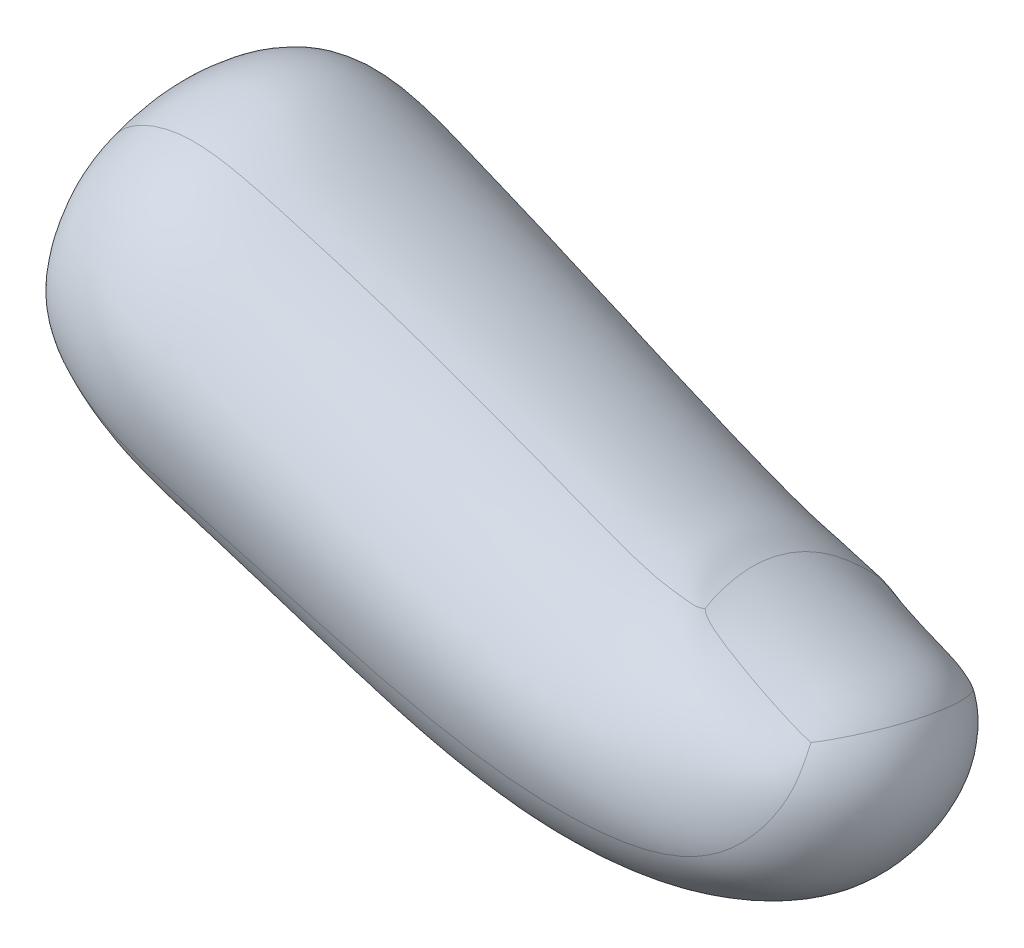
ISO-10303-21;
HEADER;
FILE_DESCRIPTION(('STEP AP214'),'2;1');
FILE_NAME('part.step','',(''),(''),'','','');
FILE_SCHEMA(('AUTOMOTIVE_DESIGN { 1 0 10303 214 1 1 1 1 }'));
ENDSEC;
DATA;
#1=APPLICATION_CONTEXT('core data for automotive mechanical design processes');
#2=APPLICATION_PROTOCOL_DEFINITION('international standard','automotive_design',2000,#1);
#3=PRODUCT_CONTEXT('',#1,'mechanical');
#4=PRODUCT('Part','Part','',(#3));
#5=PRODUCT_RELATED_PRODUCT_CATEGORY('part','',(#4));
#6=PRODUCT_DEFINITION_FORMATION('','',#4);
#7=PRODUCT_DEFINITION_CONTEXT('part definition',#1,'design');
#8=PRODUCT_DEFINITION('design','',#6,#7);
#9=PRODUCT_DEFINITION_SHAPE('','',#8);
#10=(LENGTH_UNIT() NAMED_UNIT(*) SI_UNIT(.MILLI.,.METRE.));
#11=(NAMED_UNIT(*) PLANE_ANGLE_UNIT() SI_UNIT($,.RADIAN.));
#12=(NAMED_UNIT(*) SI_UNIT($,.STERADIAN.) SOLID_ANGLE_UNIT());
#13=UNCERTAINTY_MEASURE_WITH_UNIT(LENGTH_MEASURE(1.E-05),#10,'distance_accuracy_value','');
#14=(GEOMETRIC_REPRESENTATION_CONTEXT(3) GLOBAL_UNCERTAINTY_ASSIGNED_CONTEXT((#13)) GLOBAL_UNIT_ASSIGNED_CONTEXT((#10,
#11,#12)) REPRESENTATION_CONTEXT('',''));
#15=CARTESIAN_POINT('',(0.,0.,0.));
#16=DIRECTION('',(0.,0.,1.));
#17=DIRECTION('',(1.,0.,0.));
#18=AXIS2_PLACEMENT_3D('',#15,#16,#17);
#19=CARTESIAN_POINT('',(797.411544969937,1287.18132219522,-62.9718793987323));
#20=CARTESIAN_POINT('',(797.008643745802,1287.29337688331,-63.1795141346736));
#21=CARTESIAN_POINT('',(795.670890934886,1287.6474192613,-63.3538069072695));
#22=CARTESIAN_POINT('',(793.666609934307,1288.34426411418,-63.5111423785073));
#23=CARTESIAN_POINT('',(793.139974138683,1288.61720205088,-63.5243438843362));
#24=CARTESIAN_POINT('',(792.961037564572,1288.79800179208,-63.4158314529788));
#25=CARTESIAN_POINT('',(797.532492895257,1286.84421132706,-62.994770262204));
#26=CARTESIAN_POINT('',(796.847638372289,1286.73120983509,-63.4329305975799));
#27=CARTESIAN_POINT('',(795.44107300623,1287.09301087802,-63.7136292086165));
#28=CARTESIAN_POINT('',(793.535062489596,1287.89348900014,-63.9079374968987));
#29=CARTESIAN_POINT('',(793.110165674875,1288.26618057716,-63.8900291168874));
#30=CARTESIAN_POINT('',(792.856665045613,1288.71289092585,-63.5444178535974));
#31=CARTESIAN_POINT('',(798.166016557807,1285.51123909358,-62.4975502007542));
#32=CARTESIAN_POINT('',(797.288229355358,1285.51564387994,-63.1095790304249));
#33=CARTESIAN_POINT('',(795.181785946769,1285.9859274739,-63.8001405411644));
#34=CARTESIAN_POINT('',(793.153601032271,1287.32845187537,-64.1088660780534));
#35=CARTESIAN_POINT('',(792.615680329643,1288.22315143581,-63.9844747409864));
#36=CARTESIAN_POINT('',(792.356991575076,1288.79616195693,-63.6096329083348));
#37=CARTESIAN_POINT('',(796.354268974361,1282.99765389186,-61.0064313466811));
#38=CARTESIAN_POINT('',(795.495389908998,1283.32453557594,-61.8904165774561));
#39=CARTESIAN_POINT('',(793.54258132333,1284.61969423253,-63.491529849666));
#40=CARTESIAN_POINT('',(792.005029974323,1286.75413373885,-64.3339478662724));
#41=CARTESIAN_POINT('',(791.506159906325,1288.2539161093,-64.0904497706911));
#42=CARTESIAN_POINT('',(791.323476518645,1288.96243509403,-63.6823092844467));
#43=CARTESIAN_POINT('',(793.616350855721,1281.82414164481,-60.0430304655815));
#44=CARTESIAN_POINT('',(793.072621567485,1282.22338395794,-61.0523417809662));
#45=CARTESIAN_POINT('',(791.543175778298,1283.88169136893,-63.0418973679519));
#46=CARTESIAN_POINT('',(790.522438427448,1286.52699722224,-64.4337701831453));
#47=CARTESIAN_POINT('',(790.317411432948,1288.35719617161,-64.1459441009435));
#48=CARTESIAN_POINT('',(790.231694777147,1289.14325321274,-63.7231599440941));
#49=CARTESIAN_POINT('',(789.45797145179,1282.00766671777,-59.9640444276176));
#50=CARTESIAN_POINT('',(789.184394038107,1282.41446840662,-61.0688694764341));
#51=CARTESIAN_POINT('',(788.690130504977,1283.84332673713,-63.0809050010093));
#52=CARTESIAN_POINT('',(788.099663371334,1287.1950609687,-64.6472866856391));
#53=CARTESIAN_POINT('',(787.895361607725,1289.08334965755,-64.2804945268759));
#54=CARTESIAN_POINT('',(787.856905763496,1289.87931753594,-63.8333337499514));
#55=CARTESIAN_POINT('',(785.100203205622,1282.96935593555,-60.4158291433008));
#56=CARTESIAN_POINT('',(784.865249777983,1283.45944927341,-61.5704773533203));
#57=CARTESIAN_POINT('',(784.492931987352,1284.99806094629,-63.5530982212717));
#58=CARTESIAN_POINT('',(784.037564710334,1288.48351865397,-64.9197919279432));
#59=CARTESIAN_POINT('',(783.97897366021,1290.44496197972,-64.4834464318349));
#60=CARTESIAN_POINT('',(783.998895653175,1291.26246949425,-64.016002615613));
#61=CARTESIAN_POINT('',(780.614392868672,1284.46048729474,-60.9237414317194));
#62=CARTESIAN_POINT('',(780.356204125027,1284.99529443076,-62.0720118100063));
#63=CARTESIAN_POINT('',(779.863394989144,1286.62261089957,-63.9524542514986));
#64=CARTESIAN_POINT('',(779.028527863633,1290.31373902435,-65.1393116068106));
#65=CARTESIAN_POINT('',(778.745327116872,1292.43490988028,-64.6877220963697));
#66=CARTESIAN_POINT('',(778.734199471106,1293.29914000295,-64.2071154031886));
#67=CARTESIAN_POINT('',(776.226213762174,1286.05253503244,-61.286298123395));
#68=CARTESIAN_POINT('',(776.04092789071,1286.56422271626,-62.4140927728405));
#69=CARTESIAN_POINT('',(775.691445054778,1288.10655590821,-64.1883675096021));
#70=CARTESIAN_POINT('',(775.690824066809,1291.47723005308,-65.2088494057945));
#71=CARTESIAN_POINT('',(775.54293862146,1293.61664914427,-64.7409802911339));
#72=CARTESIAN_POINT('',(775.59271650489,1294.50523046164,-64.2481627255562));
#73=CARTESIAN_POINT('',(773.19394193702,1287.10969562193,-61.39924786328));
#74=CARTESIAN_POINT('',(773.049882856874,1287.59477238308,-62.5293353270841));
#75=CARTESIAN_POINT('',(772.788764195105,1289.04060446868,-64.2838204169572));
#76=CARTESIAN_POINT('',(772.353034818697,1292.64072111566,-65.2783761875634));
#77=CARTESIAN_POINT('',(772.340521495847,1294.79838796338,-64.7942361437076));
#78=CARTESIAN_POINT('',(772.451218269573,1295.71132372001,-64.2892107829999));
#79=CARTESIAN_POINT('',(770.723689772903,1288.03766370964,-61.01483673968));
#80=CARTESIAN_POINT('',(770.59434323429,1288.47316336341,-62.0294329419542));
#81=CARTESIAN_POINT('',(770.359893005082,1289.77122604262,-63.6046118902467));
#82=CARTESIAN_POINT('',(769.968638650509,1293.00342156196,-64.497519447934));
#83=CARTESIAN_POINT('',(769.957436802296,1294.94059340445,-64.0628623468804));
#84=CARTESIAN_POINT('',(770.056832688499,1295.76023432806,-63.6094494579739));
#85=CARTESIAN_POINT('',(768.661689065041,1289.1133088676,-60.0598965703203));
#86=CARTESIAN_POINT('',(768.562398531616,1289.44457245907,-60.8634208023161));
#87=CARTESIAN_POINT('',(768.382404845466,1290.44202074435,-62.1288228610418));
#88=CARTESIAN_POINT('',(768.324172459787,1292.92309017967,-62.8614928128464));
#89=CARTESIAN_POINT('',(768.319759355252,1294.41941906099,-62.4904173165448));
#90=CARTESIAN_POINT('',(768.392930358716,1295.05858339289,-62.1196721494449));
#91=CARTESIAN_POINT('',(767.978816031637,1290.56828680636,-59.0743108708162));
#92=CARTESIAN_POINT('',(767.931832182685,1290.74735332811,-59.5607561312119));
#93=CARTESIAN_POINT('',(767.831446240862,1291.38618824829,-60.2778365448945));
#94=CARTESIAN_POINT('',(767.667511416778,1292.92674924584,-60.7440476346137));
#95=CARTESIAN_POINT('',(767.655664434794,1293.81582728254,-60.5788871647211));
#96=CARTESIAN_POINT('',(767.686756735113,1294.18119921308,-60.3349363305837));
#97=CARTESIAN_POINT('',(767.857026824207,1290.87302831771,-58.8653745967874));
#98=CARTESIAN_POINT('',(767.772640296012,1291.11493233427,-59.0041290899599));
#99=CARTESIAN_POINT('',(767.677685712826,1291.72405334594,-59.5565590990897));
#100=CARTESIAN_POINT('',(767.553276983522,1292.99018197077,-59.9597307371323));
#101=CARTESIAN_POINT('',(767.553726573681,1293.73654233623,-59.9081244714025));
#102=CARTESIAN_POINT('',(767.608434060934,1294.00655193869,-59.9690781464279));
#103=(BOUNDED_SURFACE() B_SPLINE_SURFACE(3,3,((#19,#20,#21,#22,#23,#24),(#25,#26,#27,#28,#29,
#30),(#31,#32,#33,#34,#35,#36),(#37,#38,#39,#40,#41,#42),(#43,#44,#45,#46,#47,#48),(#49,#50,#51,
#52,#53,#54),(#55,#56,#57,#58,#59,#60),(#61,#62,#63,#64,#65,#66),(#67,#68,#69,#70,#71,#72),(#73,
#74,#75,#76,#77,#78),(#79,#80,#81,#82,#83,#84),(#85,#86,#87,#88,#89,#90),(#91,#92,#93,#94,#95,
#96),(#97,#98,#99,#100,#101,#102)),.UNSPECIFIED.,.F.,.F.,.F.) B_SPLINE_SURFACE_WITH_KNOTS((4,1,
1,1,1,1,1,1,1,1,1,4),(4,1,1,4),(0.,1.,2.,3.,4.,5.,6.,7.,8.,9.,10.,11.),(0.,1.,2.,3.),
.UNSPECIFIED.) GEOMETRIC_REPRESENTATION_ITEM() RATIONAL_B_SPLINE_SURFACE(((0.75,1.,1.,1.,1.,
0.75),(1.,1.,1.,1.,1.,1.),(1.,1.,1.,1.,1.,1.),(1.,1.,1.,1.,1.,1.),(1.,1.,1.,1.,1.,1.),(1.,1.,1.,
1.,1.,1.),(1.,1.,1.,1.,1.,1.),(1.,1.,1.,1.,1.,1.),(1.,1.,1.,1.,1.,1.),(1.,1.,1.,1.,1.,1.),(1.,
1.,1.,1.,1.,1.),(1.,1.,1.,1.,1.,1.),(1.,1.,1.,1.,1.,1.),(0.75,1.,1.,1.,1.,0.75))) REPRESENTATION_ITEM('') SURFACE());
#104=CARTESIAN_POINT('',(767.857026824207,1290.87302831771,-58.8653745967874));
#105=CARTESIAN_POINT('',(767.978816031637,1290.56828680636,-59.0743108708162));
#106=CARTESIAN_POINT('',(768.661689065041,1289.1133088676,-60.0598965703203));
#107=CARTESIAN_POINT('',(770.723689772903,1288.03766370964,-61.01483673968));
#108=CARTESIAN_POINT('',(773.19394193702,1287.10969562193,-61.39924786328));
#109=CARTESIAN_POINT('',(776.226213762174,1286.05253503244,-61.286298123395));
#110=CARTESIAN_POINT('',(780.614392868672,1284.46048729474,-60.9237414317194));
#111=CARTESIAN_POINT('',(785.100203205622,1282.96935593555,-60.4158291433008));
#112=CARTESIAN_POINT('',(789.45797145179,1282.00766671777,-59.9640444276176));
#113=CARTESIAN_POINT('',(793.616350855721,1281.82414164481,-60.0430304655815));
#114=CARTESIAN_POINT('',(796.354268974361,1282.99765389186,-61.0064313466811));
#115=CARTESIAN_POINT('',(798.166016557807,1285.51123909358,-62.4975502007542));
#116=CARTESIAN_POINT('',(797.532492895257,1286.84421132706,-62.994770262204));
#117=CARTESIAN_POINT('',(797.411544969937,1287.18132219522,-62.9718793987323));
#118=(BOUNDED_CURVE() B_SPLINE_CURVE(3,(#104,#105,#106,#107,#108,#109,#110,#111,#112,#113,#114,
#115,#116,#117),.UNSPECIFIED.,.F.,.F.) B_SPLINE_CURVE_WITH_KNOTS((4,1,1,1,1,1,1,1,1,1,1,4),(0.,
1.,2.,3.,4.,5.,6.,7.,8.,9.,10.,11.),
.UNSPECIFIED.) CURVE() GEOMETRIC_REPRESENTATION_ITEM() RATIONAL_B_SPLINE_CURVE((0.75,1.,1.,1.,
1.,1.,1.,1.,1.,1.,1.,1.,1.,0.75)) REPRESENTATION_ITEM(''));
#119=CARTESIAN_POINT('',(767.857026824207,1290.87302831771,-58.8653745967874));
#120=VERTEX_POINT('',#119);
#121=CARTESIAN_POINT('',(797.411544969937,1287.18132219522,-62.9718793987324));
#122=VERTEX_POINT('',#121);
#123=EDGE_CURVE('E88',#120,#122,#118,.T.);
#124=CARTESIAN_POINT('',(767.857026824207,1290.87302831771,-58.8653745967874));
#125=CARTESIAN_POINT('',(767.772640296012,1291.11493233427,-59.0041290899599));
#126=CARTESIAN_POINT('',(767.677685712826,1291.72405334594,-59.5565590990897));
#127=CARTESIAN_POINT('',(767.553276983522,1292.99018197077,-59.9597307371323));
#128=CARTESIAN_POINT('',(767.553726573681,1293.73654233623,-59.9081244714025));
#129=CARTESIAN_POINT('',(767.608434060934,1294.00655193869,-59.9690781464279));
#130=(BOUNDED_CURVE() B_SPLINE_CURVE(3,(#124,#125,#126,#127,#128,#129),.UNSPECIFIED.,.F.,
.F.) B_SPLINE_CURVE_WITH_KNOTS((4,1,1,4),(0.,1.,2.,3.),
.UNSPECIFIED.) CURVE() GEOMETRIC_REPRESENTATION_ITEM() RATIONAL_B_SPLINE_CURVE((0.75,1.,1.,1.,
1.,0.75)) REPRESENTATION_ITEM(''));
#131=CARTESIAN_POINT('',(767.608434060934,1294.00655193869,-59.969078146428));
#132=VERTEX_POINT('',#131);
#133=EDGE_CURVE('E83',#132,#120,#130,.F.);
#134=CARTESIAN_POINT('',(792.961037564572,1288.79800179208,-63.4158314529788));
#135=CARTESIAN_POINT('',(792.856665045613,1288.71289092585,-63.5444178535974));
#136=CARTESIAN_POINT('',(792.356991575076,1288.79616195693,-63.6096329083348));
#137=CARTESIAN_POINT('',(791.323476518645,1288.96243509403,-63.6823092844467));
#138=CARTESIAN_POINT('',(790.231694777147,1289.14325321274,-63.7231599440941));
#139=CARTESIAN_POINT('',(787.856905763496,1289.87931753594,-63.8333337499514));
#140=CARTESIAN_POINT('',(783.998895653175,1291.26246949425,-64.016002615613));
#141=CARTESIAN_POINT('',(778.734199471106,1293.29914000295,-64.2071154031886));
#142=CARTESIAN_POINT('',(775.59271650489,1294.50523046164,-64.2481627255562));
#143=CARTESIAN_POINT('',(772.451218269573,1295.71132372001,-64.2892107829999));
#144=CARTESIAN_POINT('',(770.056832688499,1295.76023432806,-63.6094494579739));
#145=CARTESIAN_POINT('',(768.392930358716,1295.05858339289,-62.1196721494449));
#146=CARTESIAN_POINT('',(767.686756735113,1294.18119921308,-60.3349363305837));
#147=CARTESIAN_POINT('',(767.608434060934,1294.00655193869,-59.9690781464279));
#148=(BOUNDED_CURVE() B_SPLINE_CURVE(3,(#134,#135,#136,#137,#138,#139,#140,#141,#142,#143,#144,
#145,#146,#147),.UNSPECIFIED.,.F.,.F.) B_SPLINE_CURVE_WITH_KNOTS((4,1,1,1,1,1,1,1,1,1,1,4),(0.,
1.,2.,3.,4.,5.,6.,7.,8.,9.,10.,11.),
.UNSPECIFIED.) CURVE() GEOMETRIC_REPRESENTATION_ITEM() RATIONAL_B_SPLINE_CURVE((0.75,1.,1.,1.,
1.,1.,1.,1.,1.,1.,1.,1.,1.,0.75)) REPRESENTATION_ITEM(''));
#149=CARTESIAN_POINT('',(792.961037564572,1288.79800179208,-63.4158314529787));
#150=VERTEX_POINT('',#149);
#151=EDGE_CURVE('E85',#150,#132,#148,.T.);
#152=CARTESIAN_POINT('',(797.411544969937,1287.18132219522,-62.9718793987323));
#153=CARTESIAN_POINT('',(797.008643745802,1287.29337688331,-63.1795141346736));
#154=CARTESIAN_POINT('',(795.670890934886,1287.6474192613,-63.3538069072695));
#155=CARTESIAN_POINT('',(793.666609934307,1288.34426411418,-63.5111423785073));
#156=CARTESIAN_POINT('',(793.139974138683,1288.61720205088,-63.5243438843362));
#157=CARTESIAN_POINT('',(792.961037564572,1288.79800179208,-63.4158314529788));
#158=(BOUNDED_CURVE() B_SPLINE_CURVE(3,(#152,#153,#154,#155,#156,#157),.UNSPECIFIED.,.F.,
.F.) B_SPLINE_CURVE_WITH_KNOTS((4,1,1,4),(0.,1.,2.,3.),
.UNSPECIFIED.) CURVE() GEOMETRIC_REPRESENTATION_ITEM() RATIONAL_B_SPLINE_CURVE((0.75,1.,1.,1.,
1.,0.75)) REPRESENTATION_ITEM(''));
#159=EDGE_CURVE('E104',#122,#150,#158,.T.);
#160=ORIENTED_EDGE('',*,*,#123,.F.);
#161=ORIENTED_EDGE('',*,*,#133,.F.);
#162=ORIENTED_EDGE('',*,*,#151,.F.);
#163=ORIENTED_EDGE('',*,*,#159,.F.);
#164=EDGE_LOOP('',(#160,#161,#162,#163));
#165=FACE_BOUND('',#164,.T.);
#166=ADVANCED_FACE('F37',(#165),#103,.T.);
#167=CARTESIAN_POINT('',(767.857026824207,1290.87302831771,-58.8653745967874));
#168=CARTESIAN_POINT('',(767.772640296012,1291.11493233427,-59.0041290899599));
#169=CARTESIAN_POINT('',(767.677685712826,1291.72405334594,-59.5565590990897));
#170=CARTESIAN_POINT('',(767.553276983522,1292.99018197077,-59.9597307371323));
#171=CARTESIAN_POINT('',(767.553726573681,1293.73654233623,-59.9081244714025));
#172=CARTESIAN_POINT('',(767.608434060934,1294.00655193869,-59.9690781464279));
#173=CARTESIAN_POINT('',(767.819624144946,1290.93586581251,-58.5176838295534));
#174=CARTESIAN_POINT('',(767.613448409339,1291.48251134042,-58.4475020487188));
#175=CARTESIAN_POINT('',(767.523925184792,1292.0619184436,-58.8352816532742));
#176=CARTESIAN_POINT('',(767.439042550265,1293.05361469571,-59.175413839651));
#177=CARTESIAN_POINT('',(767.451788712567,1293.65725738993,-59.2373617780838));
#178=CARTESIAN_POINT('',(767.584818874009,1294.10191426677,-59.6641736372869));
#179=CARTESIAN_POINT('',(767.860298273011,1290.98091780687,-57.4414117686239));
#180=CARTESIAN_POINT('',(767.60724721156,1291.65004649599,-57.5236585548039));
#181=CARTESIAN_POINT('',(767.459841677235,1292.46921133029,-57.8011581861478));
#182=CARTESIAN_POINT('',(767.40988801695,1293.32749476122,-58.1429494404172));
#183=CARTESIAN_POINT('',(767.479254345276,1293.96751761509,-58.4531991691357));
#184=CARTESIAN_POINT('',(767.666659781988,1294.54324922207,-58.866770899528));
#185=CARTESIAN_POINT('',(768.050665132778,1291.47856461576,-55.753258057929));
#186=CARTESIAN_POINT('',(767.76501711765,1292.06958002494,-56.1250672740822));
#187=CARTESIAN_POINT('',(767.619338783179,1292.84806401318,-56.4897953150027));
#188=CARTESIAN_POINT('',(767.58730014699,1293.77489891399,-56.9262223977044));
#189=CARTESIAN_POINT('',(767.683470503185,1294.36806064691,-57.2029900757556));
#190=CARTESIAN_POINT('',(767.921983172734,1294.98832408316,-57.4028234912637));
#191=CARTESIAN_POINT('',(768.164996740183,1292.0825355768,-54.8927902113928));
#192=CARTESIAN_POINT('',(767.930180174037,1292.49076113717,-55.3072721720367));
#193=CARTESIAN_POINT('',(767.89582393003,1293.18255380322,-55.4411833371181));
#194=CARTESIAN_POINT('',(767.885248648089,1294.14388140032,-55.9506317314262));
#195=CARTESIAN_POINT('',(767.903881303936,1294.57962666919,-56.3708587854109));
#196=CARTESIAN_POINT('',(768.132087033292,1295.11186127724,-56.4391368329585));
#197=CARTESIAN_POINT('',(768.260299503641,1292.23920587265,-54.5968294791023));
#198=CARTESIAN_POINT('',(768.190542602298,1292.52165380076,-54.6560900932791));
#199=CARTESIAN_POINT('',(768.192706125332,1293.35240617683,-54.7012157351058));
#200=CARTESIAN_POINT('',(768.189950867067,1294.54389523715,-55.3666089639353));
#201=CARTESIAN_POINT('',(768.187779907249,1295.00108153633,-55.9691250479095));
#202=CARTESIAN_POINT('',(768.245284192376,1295.21541965267,-56.1485549921083));
#203=(BOUNDED_SURFACE() B_SPLINE_SURFACE(3,3,((#167,#168,#169,#170,#171,#172),(#173,#174,#175,
#176,#177,#178),(#179,#180,#181,#182,#183,#184),(#185,#186,#187,#188,#189,#190),(#191,#192,#193,
#194,#195,#196),(#197,#198,#199,#200,#201,#202)),.UNSPECIFIED.,.F.,.F.,
.F.) B_SPLINE_SURFACE_WITH_KNOTS((4,1,1,4),(4,1,1,4),(0.,1.,2.,3.),(0.,1.,2.,3.),
.UNSPECIFIED.) GEOMETRIC_REPRESENTATION_ITEM() RATIONAL_B_SPLINE_SURFACE(((0.75,1.,1.,1.,1.,
0.75),(1.,1.,1.,1.,1.,1.),(1.,1.,1.,1.,1.,1.),(1.,1.,1.,1.,1.,1.),(1.,1.,1.,1.,1.,1.),(0.75,1.,
1.,1.,1.,0.75))) REPRESENTATION_ITEM('') SURFACE());
#204=CARTESIAN_POINT('',(767.857026824207,1290.87302831771,-58.8653745967874));
#205=CARTESIAN_POINT('',(767.819624144946,1290.93586581251,-58.5176838295534));
#206=CARTESIAN_POINT('',(767.860298273011,1290.98091780687,-57.4414117686239));
#207=CARTESIAN_POINT('',(768.050665132778,1291.47856461576,-55.753258057929));
#208=CARTESIAN_POINT('',(768.164996740183,1292.0825355768,-54.8927902113928));
#209=CARTESIAN_POINT('',(768.260299503641,1292.23920587265,-54.5968294791023));
#210=(BOUNDED_CURVE() B_SPLINE_CURVE(3,(#204,#205,#206,#207,#208,#209),.UNSPECIFIED.,.F.,
.F.) B_SPLINE_CURVE_WITH_KNOTS((4,1,1,4),(0.,1.,2.,3.),
.UNSPECIFIED.) CURVE() GEOMETRIC_REPRESENTATION_ITEM() RATIONAL_B_SPLINE_CURVE((0.75,1.,1.,1.,
1.,0.75)) REPRESENTATION_ITEM(''));
#211=CARTESIAN_POINT('',(768.260299503641,1292.23920587265,-54.5968294791021));
#212=VERTEX_POINT('',#211);
#213=EDGE_CURVE('E119',#212,#120,#210,.F.);
#214=CARTESIAN_POINT('',(768.260299503641,1292.23920587265,-54.5968294791023));
#215=CARTESIAN_POINT('',(768.190542602298,1292.52165380076,-54.6560900932791));
#216=CARTESIAN_POINT('',(768.192706125332,1293.35240617683,-54.7012157351058));
#217=CARTESIAN_POINT('',(768.189950867067,1294.54389523715,-55.3666089639353));
#218=CARTESIAN_POINT('',(768.187779907249,1295.00108153633,-55.9691250479095));
#219=CARTESIAN_POINT('',(768.245284192376,1295.21541965267,-56.1485549921083));
#220=(BOUNDED_CURVE() B_SPLINE_CURVE(3,(#214,#215,#216,#217,#218,#219),.UNSPECIFIED.,.F.,
.F.) B_SPLINE_CURVE_WITH_KNOTS((4,1,1,4),(0.,1.,2.,3.),
.UNSPECIFIED.) CURVE() GEOMETRIC_REPRESENTATION_ITEM() RATIONAL_B_SPLINE_CURVE((0.75,1.,1.,1.,
1.,0.75)) REPRESENTATION_ITEM(''));
#221=CARTESIAN_POINT('',(768.245284192376,1295.21541965267,-56.1485549921084));
#222=VERTEX_POINT('',#221);
#223=EDGE_CURVE('E62',#222,#212,#220,.F.);
#224=CARTESIAN_POINT('',(767.608434060934,1294.00655193869,-59.9690781464279));
#225=CARTESIAN_POINT('',(767.584818874009,1294.10191426677,-59.6641736372869));
#226=CARTESIAN_POINT('',(767.666659781988,1294.54324922207,-58.866770899528));
#227=CARTESIAN_POINT('',(767.921983172734,1294.98832408316,-57.4028234912637));
#228=CARTESIAN_POINT('',(768.132087033292,1295.11186127724,-56.4391368329585));
#229=CARTESIAN_POINT('',(768.245284192376,1295.21541965267,-56.1485549921083));
#230=(BOUNDED_CURVE() B_SPLINE_CURVE(3,(#224,#225,#226,#227,#228,#229),.UNSPECIFIED.,.F.,
.F.) B_SPLINE_CURVE_WITH_KNOTS((4,1,1,4),(0.,1.,2.,3.),
.UNSPECIFIED.) CURVE() GEOMETRIC_REPRESENTATION_ITEM() RATIONAL_B_SPLINE_CURVE((0.75,1.,1.,1.,
1.,0.75)) REPRESENTATION_ITEM(''));
#231=EDGE_CURVE('E91',#132,#222,#230,.T.);
#232=ORIENTED_EDGE('',*,*,#213,.F.);
#233=ORIENTED_EDGE('',*,*,#223,.F.);
#234=ORIENTED_EDGE('',*,*,#231,.F.);
#235=ORIENTED_EDGE('',*,*,#133,.T.);
#236=EDGE_LOOP('',(#232,#233,#234,#235));
#237=FACE_BOUND('',#236,.T.);
#238=ADVANCED_FACE('F93',(#237),#203,.T.);
#239=CARTESIAN_POINT('',(792.961037564572,1288.79800179208,-63.4158314529788));
#240=CARTESIAN_POINT('',(792.88647350942,1289.06391239956,-63.1787326210354));
#241=CARTESIAN_POINT('',(792.404294913238,1290.45151568511,-61.812316631386));
#242=CARTESIAN_POINT('',(792.47343178954,1291.5463649802,-58.6452041388084));
#243=CARTESIAN_POINT('',(793.016484378215,1291.39537509352,-56.5407073724734));
#244=CARTESIAN_POINT('',(793.141663670773,1291.34055716539,-56.148981900131));
#245=CARTESIAN_POINT('',(792.856665045613,1288.71289092585,-63.5444178535974));
#246=CARTESIAN_POINT('',(792.60316441634,1289.15960127452,-63.1988065902855));
#247=CARTESIAN_POINT('',(792.01405871397,1290.57375109218,-61.8342699171039));
#248=CARTESIAN_POINT('',(792.070016592632,1291.68957018123,-58.6871357317935));
#249=CARTESIAN_POINT('',(792.698772520864,1291.52213680294,-56.5693637024033));
#250=CARTESIAN_POINT('',(793.04539738838,1291.37652905603,-55.9674473289246));
#251=CARTESIAN_POINT('',(792.356991575076,1288.79616195693,-63.6096329083348));
#252=CARTESIAN_POINT('',(792.09830282052,1289.36917247805,-63.2347910756613));
#253=CARTESIAN_POINT('',(791.601468504921,1290.76651500209,-61.8598150820674));
#254=CARTESIAN_POINT('',(791.701896911422,1291.87283366377,-58.7266317527321));
#255=CARTESIAN_POINT('',(792.314422145545,1291.72238944756,-56.6026286668361));
#256=CARTESIAN_POINT('',(792.682373596505,1291.50623650089,-55.8831704757002));
#257=CARTESIAN_POINT('',(791.323476518645,1288.96243509403,-63.6823092844467));
#258=CARTESIAN_POINT('',(791.140793130983,1289.67095407876,-63.2741687982023));
#259=CARTESIAN_POINT('',(790.908929648289,1291.00524764723,-61.885104948806));
#260=CARTESIAN_POINT('',(791.042587765523,1292.10442062566,-58.7623634498069));
#261=CARTESIAN_POINT('',(791.642997025929,1291.96671850552,-56.633693695795));
#262=CARTESIAN_POINT('',(791.963816976486,1291.69661988167,-55.7866674746411));
#263=CARTESIAN_POINT('',(790.231694777147,1289.14325321274,-63.7231599440941));
#264=CARTESIAN_POINT('',(790.145978121346,1289.92931025386,-63.3003757872448));
#265=CARTESIAN_POINT('',(790.00813849265,1291.24333946898,-61.8970652420494));
#266=CARTESIAN_POINT('',(790.220943928046,1292.32310274937,-58.7911746862897));
#267=CARTESIAN_POINT('',(790.761387593487,1292.22022829998,-56.6550112611198));
#268=CARTESIAN_POINT('',(791.03800867744,1291.93512646042,-55.7387458849043));
#269=CARTESIAN_POINT('',(787.856905763496,1289.87931753594,-63.8333337499514));
#270=CARTESIAN_POINT('',(787.818449919266,1290.67528541432,-63.3861729730269));
#271=CARTESIAN_POINT('',(787.868928305985,1291.97086823902,-61.9643220241244));
#272=CARTESIAN_POINT('',(788.100678018403,1293.03360561546,-58.8753442329536));
#273=CARTESIAN_POINT('',(788.556998645602,1292.9627737738,-56.7245999185809));
#274=CARTESIAN_POINT('',(788.79455750973,1292.70196321056,-55.787915057013));
#275=CARTESIAN_POINT('',(783.998895653175,1291.26246949425,-64.016002615613));
#276=CARTESIAN_POINT('',(784.01881764614,1292.07997700876,-63.5485587993913));
#277=CARTESIAN_POINT('',(784.157096668106,1293.38856374113,-62.1151290306018));
#278=CARTESIAN_POINT('',(784.677674995866,1294.28463119211,-59.0111171042798));
#279=CARTESIAN_POINT('',(785.142213088757,1294.1873323132,-56.8424969576766));
#280=CARTESIAN_POINT('',(785.363334100041,1293.93726976687,-55.8682999936246));
#281=CARTESIAN_POINT('',(778.734199471106,1293.29914000295,-64.2071154031886));
#282=CARTESIAN_POINT('',(778.723071825351,1294.16337012563,-63.7265087099855));
#283=CARTESIAN_POINT('',(778.961761989097,1295.49911976042,-62.2556714476144));
#284=CARTESIAN_POINT('',(779.610344151263,1296.33545251491,-59.0387390562372));
#285=CARTESIAN_POINT('',(780.15211075813,1296.17498923154,-56.787431765922));
#286=CARTESIAN_POINT('',(780.422452531762,1295.88557379418,-55.7697013080741));
#287=CARTESIAN_POINT('',(775.59271650489,1294.50523046164,-64.2481627255562));
#288=CARTESIAN_POINT('',(775.64249438832,1295.39381177902,-63.7553451599786));
#289=CARTESIAN_POINT('',(775.989491367389,1296.80871795731,-62.2519440123182));
#290=CARTESIAN_POINT('',(776.663645457454,1297.71783163399,-58.8869398481771));
#291=CARTESIAN_POINT('',(777.098431528569,1297.51496354739,-56.5164434502286));
#292=CARTESIAN_POINT('',(777.232465567321,1297.22609464199,-55.4514374958644));
#293=CARTESIAN_POINT('',(772.451218269573,1295.71132372001,-64.2892107829999));
#294=CARTESIAN_POINT('',(772.561915043289,1296.62425947663,-63.7841854222923));
#295=CARTESIAN_POINT('',(773.017215460995,1298.1183356554,-62.2482240233062));
#296=CARTESIAN_POINT('',(773.716941515591,1299.1002303683,-58.7351477538599));
#297=CARTESIAN_POINT('',(774.044804140496,1298.85495783606,-56.2454684845567));
#298=CARTESIAN_POINT('',(774.12728096712,1298.53544226652,-55.1429898732893));
#299=CARTESIAN_POINT('',(770.056832688499,1295.76023432806,-63.6094494579739));
#300=CARTESIAN_POINT('',(770.156228574692,1296.57987525166,-63.1560365690893));
#301=CARTESIAN_POINT('',(770.565013967699,1297.92126710358,-61.7770421145603));
#302=CARTESIAN_POINT('',(771.193241214981,1298.80282396847,-58.6229840038465));
#303=CARTESIAN_POINT('',(771.487548761791,1298.58262047977,-56.3877300562331));
#304=CARTESIAN_POINT('',(771.561592180677,1298.29575829893,-55.3979176485366));
#305=CARTESIAN_POINT('',(768.392930358716,1295.05858339289,-62.1196721494449));
#306=CARTESIAN_POINT('',(768.46610136218,1295.6977477248,-61.7489269823449));
#307=CARTESIAN_POINT('',(768.763198480553,1296.75807617114,-60.6370218102361));
#308=CARTESIAN_POINT('',(769.018376164265,1297.49647953143,-58.1252228907425));
#309=CARTESIAN_POINT('',(769.254483024207,1297.33728904868,-56.3603000167118));
#310=CARTESIAN_POINT('',(769.320672573627,1297.11703944928,-55.5764438337128));
#311=CARTESIAN_POINT('',(767.686756735113,1294.18119921308,-60.3349363305837));
#312=CARTESIAN_POINT('',(767.71784903544,1294.54657114359,-60.0909854964681));
#313=CARTESIAN_POINT('',(767.854065218708,1295.11898082903,-59.2803426298985));
#314=CARTESIAN_POINT('',(768.160495842283,1295.60858751939,-57.6026569067609));
#315=CARTESIAN_POINT('',(768.360292762639,1295.6440958853,-56.507414880506));
#316=CARTESIAN_POINT('',(768.415985636596,1295.53331614441,-56.0374030954461));
#317=CARTESIAN_POINT('',(767.608434060934,1294.00655193869,-59.9690781464279));
#318=CARTESIAN_POINT('',(767.584818874009,1294.10191426677,-59.6641736372869));
#319=CARTESIAN_POINT('',(767.666659781988,1294.54324922207,-58.866770899528));
#320=CARTESIAN_POINT('',(767.921983172734,1294.98832408316,-57.4028234912637));
#321=CARTESIAN_POINT('',(768.132087033292,1295.11186127724,-56.4391368329585));
#322=CARTESIAN_POINT('',(768.245284192376,1295.21541965267,-56.1485549921083));
#323=(BOUNDED_SURFACE() B_SPLINE_SURFACE(3,3,((#239,#240,#241,#242,#243,#244),(#245,#246,#247,
#248,#249,#250),(#251,#252,#253,#254,#255,#256),(#257,#258,#259,#260,#261,#262),(#263,#264,#265,
#266,#267,#268),(#269,#270,#271,#272,#273,#274),(#275,#276,#277,#278,#279,#280),(#281,#282,#283,
#284,#285,#286),(#287,#288,#289,#290,#291,#292),(#293,#294,#295,#296,#297,#298),(#299,#300,#301,
#302,#303,#304),(#305,#306,#307,#308,#309,#310),(#311,#312,#313,#314,#315,#316),(#317,#318,#319,
#320,#321,#322)),.UNSPECIFIED.,.F.,.F.,.F.) B_SPLINE_SURFACE_WITH_KNOTS((4,1,1,1,1,1,1,1,1,1,1,
4),(4,1,1,4),(0.,1.,2.,3.,4.,5.,6.,7.,8.,9.,10.,11.),(0.,1.,2.,3.),
.UNSPECIFIED.) GEOMETRIC_REPRESENTATION_ITEM() RATIONAL_B_SPLINE_SURFACE(((0.75,1.,1.,1.,1.,
0.75),(1.,1.,1.,1.,1.,1.),(1.,1.,1.,1.,1.,1.),(1.,1.,1.,1.,1.,1.),(1.,1.,1.,1.,1.,1.),(1.,1.,1.,
1.,1.,1.),(1.,1.,1.,1.,1.,1.),(1.,1.,1.,1.,1.,1.),(1.,1.,1.,1.,1.,1.),(1.,1.,1.,1.,1.,1.),(1.,
1.,1.,1.,1.,1.),(1.,1.,1.,1.,1.,1.),(1.,1.,1.,1.,1.,1.),(0.75,1.,1.,1.,1.,0.75))) REPRESENTATION_ITEM('') SURFACE());
#324=CARTESIAN_POINT('',(768.245284192376,1295.21541965267,-56.1485549921083));
#325=CARTESIAN_POINT('',(768.415985636596,1295.53331614441,-56.0374030954461));
#326=CARTESIAN_POINT('',(769.320672573627,1297.11703944928,-55.5764438337128));
#327=CARTESIAN_POINT('',(771.561592180677,1298.29575829893,-55.3979176485366));
#328=CARTESIAN_POINT('',(774.12728096712,1298.53544226652,-55.1429898732893));
#329=CARTESIAN_POINT('',(777.232465567321,1297.22609464199,-55.4514374958644));
#330=CARTESIAN_POINT('',(780.422452531762,1295.88557379418,-55.7697013080741));
#331=CARTESIAN_POINT('',(785.363334100041,1293.93726976687,-55.8682999936246));
#332=CARTESIAN_POINT('',(788.79455750973,1292.70196321056,-55.787915057013));
#333=CARTESIAN_POINT('',(791.03800867744,1291.93512646042,-55.7387458849043));
#334=CARTESIAN_POINT('',(791.963816976486,1291.69661988167,-55.7866674746411));
#335=CARTESIAN_POINT('',(792.682373596505,1291.50623650089,-55.8831704757002));
#336=CARTESIAN_POINT('',(793.04539738838,1291.37652905603,-55.9674473289246));
#337=CARTESIAN_POINT('',(793.141663670773,1291.34055716539,-56.148981900131));
#338=(BOUNDED_CURVE() B_SPLINE_CURVE(3,(#324,#325,#326,#327,#328,#329,#330,#331,#332,#333,#334,
#335,#336,#337),.UNSPECIFIED.,.F.,.F.) B_SPLINE_CURVE_WITH_KNOTS((4,1,1,1,1,1,1,1,1,1,1,4),(0.,
1.,2.,3.,4.,5.,6.,7.,8.,9.,10.,11.),
.UNSPECIFIED.) CURVE() GEOMETRIC_REPRESENTATION_ITEM() RATIONAL_B_SPLINE_CURVE((0.75,1.,1.,1.,
1.,1.,1.,1.,1.,1.,1.,1.,1.,0.75)) REPRESENTATION_ITEM(''));
#339=CARTESIAN_POINT('',(793.141663670772,1291.34055716539,-56.1489819001309));
#340=VERTEX_POINT('',#339);
#341=EDGE_CURVE('E134',#340,#222,#338,.F.);
#342=CARTESIAN_POINT('',(792.961037564572,1288.79800179208,-63.4158314529788));
#343=CARTESIAN_POINT('',(792.88647350942,1289.06391239956,-63.1787326210354));
#344=CARTESIAN_POINT('',(792.404294913238,1290.45151568511,-61.812316631386));
#345=CARTESIAN_POINT('',(792.47343178954,1291.5463649802,-58.6452041388084));
#346=CARTESIAN_POINT('',(793.016484378215,1291.39537509352,-56.5407073724734));
#347=CARTESIAN_POINT('',(793.141663670773,1291.34055716539,-56.148981900131));
#348=(BOUNDED_CURVE() B_SPLINE_CURVE(3,(#342,#343,#344,#345,#346,#347),.UNSPECIFIED.,.F.,
.F.) B_SPLINE_CURVE_WITH_KNOTS((4,1,1,4),(0.,1.,2.,3.),
.UNSPECIFIED.) CURVE() GEOMETRIC_REPRESENTATION_ITEM() RATIONAL_B_SPLINE_CURVE((0.75,1.,1.,1.,
1.,0.75)) REPRESENTATION_ITEM(''));
#349=EDGE_CURVE('E100',#150,#340,#348,.T.);
#350=ORIENTED_EDGE('',*,*,#151,.T.);
#351=ORIENTED_EDGE('',*,*,#231,.T.);
#352=ORIENTED_EDGE('',*,*,#341,.F.);
#353=ORIENTED_EDGE('',*,*,#349,.F.);
#354=EDGE_LOOP('',(#350,#351,#352,#353));
#355=FACE_BOUND('',#354,.T.);
#356=ADVANCED_FACE('F98',(#355),#323,.T.);
#357=CARTESIAN_POINT('',(797.411544969937,1287.18132219522,-62.9718793987323));
#358=CARTESIAN_POINT('',(797.693498268761,1287.40637837527,-62.7413537993086));
#359=CARTESIAN_POINT('',(798.902230870235,1288.32983299949,-61.3368737247502));
#360=CARTESIAN_POINT('',(799.32035787643,1289.27213421725,-57.874442219828));
#361=CARTESIAN_POINT('',(798.469401365726,1289.39716201315,-55.8662479235185));
#362=CARTESIAN_POINT('',(798.221009872697,1289.41415003768,-55.4552988695755));
#363=CARTESIAN_POINT('',(797.008643745802,1287.29337688331,-63.1795141346736));
#364=CARTESIAN_POINT('',(797.169649119314,1287.85554393149,-62.926097671789));
#365=CARTESIAN_POINT('',(798.254261596443,1288.88864616917,-61.5890802530632));
#366=CARTESIAN_POINT('',(798.626418669454,1289.80079177453,-58.1229984566538));
#367=CARTESIAN_POINT('',(797.94507013112,1289.79670358702,-56.1064754583884));
#368=CARTESIAN_POINT('',(797.834648508884,1289.62241483689,-55.3699381100553));
#369=CARTESIAN_POINT('',(795.670890934886,1287.6474192613,-63.3538069072695));
#370=CARTESIAN_POINT('',(795.900708863542,1288.2018276446,-62.9939846059226));
#371=CARTESIAN_POINT('',(796.560693518678,1289.31237777361,-61.6412067330936));
#372=CARTESIAN_POINT('',(796.819889877598,1290.29326696857,-58.263239553367));
#373=CARTESIAN_POINT('',(796.470729527837,1290.27245810259,-56.2234569549905));
#374=CARTESIAN_POINT('',(796.338254735053,1290.18372585253,-55.4357420286505));
#375=CARTESIAN_POINT('',(793.666609934307,1288.34426411418,-63.5111423785073));
#376=CARTESIAN_POINT('',(793.798157379008,1288.79503922822,-63.1143472601269));
#377=CARTESIAN_POINT('',(793.942885700533,1290.03310255962,-61.7280953677273));
#378=CARTESIAN_POINT('',(794.122388092918,1291.01360245763,-58.4750421949298));
#379=CARTESIAN_POINT('',(794.220693289649,1290.96181919103,-56.4306906872452));
#380=CARTESIAN_POINT('',(794.185229543682,1290.88887144539,-55.7531640890619));
#381=CARTESIAN_POINT('',(793.139974138683,1288.61720205088,-63.5243438843362));
#382=CARTESIAN_POINT('',(793.169782602499,1288.96822352458,-63.158658651785));
#383=CARTESIAN_POINT('',(792.794531112514,1290.32928027803,-61.7903633456573));
#384=CARTESIAN_POINT('',(792.876846986457,1291.40315977917,-58.603272545845));
#385=CARTESIAN_POINT('',(793.334196235575,1291.26861338409,-56.5120510425324));
#386=CARTESIAN_POINT('',(793.363109245731,1291.24976734661,-55.9387909989839));
#387=CARTESIAN_POINT('',(792.961037564572,1288.79800179208,-63.4158314529788));
#388=CARTESIAN_POINT('',(792.88647350942,1289.06391239956,-63.1787326210354));
#389=CARTESIAN_POINT('',(792.404294913238,1290.45151568511,-61.812316631386));
#390=CARTESIAN_POINT('',(792.47343178954,1291.5463649802,-58.6452041388084));
#391=CARTESIAN_POINT('',(793.016484378215,1291.39537509352,-56.5407073724734));
#392=CARTESIAN_POINT('',(793.141663670773,1291.34055716539,-56.148981900131));
#393=(BOUNDED_SURFACE() B_SPLINE_SURFACE(3,3,((#357,#358,#359,#360,#361,#362),(#363,#364,#365,
#366,#367,#368),(#369,#370,#371,#372,#373,#374),(#375,#376,#377,#378,#379,#380),(#381,#382,#383,
#384,#385,#386),(#387,#388,#389,#390,#391,#392)),.UNSPECIFIED.,.F.,.F.,
.F.) B_SPLINE_SURFACE_WITH_KNOTS((4,1,1,4),(4,1,1,4),(0.,1.,2.,3.),(0.,1.,2.,3.),
.UNSPECIFIED.) GEOMETRIC_REPRESENTATION_ITEM() RATIONAL_B_SPLINE_SURFACE(((0.75,1.,1.,1.,1.,
0.75),(1.,1.,1.,1.,1.,1.),(1.,1.,1.,1.,1.,1.),(1.,1.,1.,1.,1.,1.),(1.,1.,1.,1.,1.,1.),(0.75,1.,
1.,1.,1.,0.75))) REPRESENTATION_ITEM('') SURFACE());
#394=CARTESIAN_POINT('',(798.221009872697,1289.41415003768,-55.4552988695755));
#395=CARTESIAN_POINT('',(797.834648508884,1289.62241483689,-55.3699381100553));
#396=CARTESIAN_POINT('',(796.338254735053,1290.18372585253,-55.4357420286505));
#397=CARTESIAN_POINT('',(794.185229543682,1290.88887144539,-55.7531640890619));
#398=CARTESIAN_POINT('',(793.363109245731,1291.24976734661,-55.9387909989839));
#399=CARTESIAN_POINT('',(793.141663670773,1291.34055716539,-56.148981900131));
#400=(BOUNDED_CURVE() B_SPLINE_CURVE(3,(#394,#395,#396,#397,#398,#399),.UNSPECIFIED.,.F.,
.F.) B_SPLINE_CURVE_WITH_KNOTS((4,1,1,4),(0.,1.,2.,3.),
.UNSPECIFIED.) CURVE() GEOMETRIC_REPRESENTATION_ITEM() RATIONAL_B_SPLINE_CURVE((0.75,1.,1.,1.,
1.,0.75)) REPRESENTATION_ITEM(''));
#401=CARTESIAN_POINT('',(798.221009872697,1289.41415003768,-55.4552988695755));
#402=VERTEX_POINT('',#401);
#403=EDGE_CURVE('E51',#402,#340,#400,.T.);
#404=CARTESIAN_POINT('',(797.411544969937,1287.18132219522,-62.9718793987323));
#405=CARTESIAN_POINT('',(797.693498268761,1287.40637837527,-62.7413537993086));
#406=CARTESIAN_POINT('',(798.902230870235,1288.32983299949,-61.3368737247502));
#407=CARTESIAN_POINT('',(799.32035787643,1289.27213421725,-57.874442219828));
#408=CARTESIAN_POINT('',(798.469401365726,1289.39716201315,-55.8662479235185));
#409=CARTESIAN_POINT('',(798.221009872697,1289.41415003768,-55.4552988695755));
#410=(BOUNDED_CURVE() B_SPLINE_CURVE(3,(#404,#405,#406,#407,#408,#409),.UNSPECIFIED.,.F.,
.F.) B_SPLINE_CURVE_WITH_KNOTS((4,1,1,4),(0.,1.,2.,3.),
.UNSPECIFIED.) CURVE() GEOMETRIC_REPRESENTATION_ITEM() RATIONAL_B_SPLINE_CURVE((0.75,1.,1.,1.,
1.,0.75)) REPRESENTATION_ITEM(''));
#411=EDGE_CURVE('E127',#122,#402,#410,.T.);
#412=ORIENTED_EDGE('',*,*,#159,.T.);
#413=ORIENTED_EDGE('',*,*,#349,.T.);
#414=ORIENTED_EDGE('',*,*,#403,.F.);
#415=ORIENTED_EDGE('',*,*,#411,.F.);
#416=EDGE_LOOP('',(#412,#413,#414,#415));
#417=FACE_BOUND('',#416,.T.);
#418=ADVANCED_FACE('F181',(#417),#393,.T.);
#419=CARTESIAN_POINT('',(767.857026824207,1290.87302831771,-58.8653745967874));
#420=CARTESIAN_POINT('',(767.819624144946,1290.93586581251,-58.5176838295534));
#421=CARTESIAN_POINT('',(767.860298273011,1290.98091780687,-57.4414117686239));
#422=CARTESIAN_POINT('',(768.050665132778,1291.47856461576,-55.753258057929));
#423=CARTESIAN_POINT('',(768.164996740183,1292.0825355768,-54.8927902113928));
#424=CARTESIAN_POINT('',(768.260299503641,1292.23920587265,-54.5968294791023));
#425=CARTESIAN_POINT('',(767.978816031637,1290.56828680636,-59.0743108708162));
#426=CARTESIAN_POINT('',(768.02579988057,1290.3892202846,-58.5878656103987));
#427=CARTESIAN_POINT('',(768.113349334471,1290.31178911775,-57.3591649824547));
#428=CARTESIAN_POINT('',(768.336313147896,1290.8875492066,-55.3814488417648));
#429=CARTESIAN_POINT('',(768.399813306319,1291.67431001642,-54.4783082507487));
#430=CARTESIAN_POINT('',(768.425359168442,1292.11342824039,-54.241608132635));
#431=CARTESIAN_POINT('',(768.661689065041,1289.1133088676,-60.0598965703203));
#432=CARTESIAN_POINT('',(768.760979598456,1288.78204527614,-59.2563723383355));
#433=CARTESIAN_POINT('',(768.978148045969,1288.45443919554,-57.3076774690895));
#434=CARTESIAN_POINT('',(769.333226873918,1289.30197155817,-54.2589400180618));
#435=CARTESIAN_POINT('',(769.304723326893,1290.73320044098,-52.954291573265));
#436=CARTESIAN_POINT('',(769.315957507057,1291.49406822375,-52.5861331874059));
#437=CARTESIAN_POINT('',(770.723689772903,1288.03766370964,-61.01483673968));
#438=CARTESIAN_POINT('',(770.853036311518,1287.60216405587,-60.0002405374058));
#439=CARTESIAN_POINT('',(771.135972236747,1287.15822811998,-57.5170346765795));
#440=CARTESIAN_POINT('',(771.608480116259,1288.21520254904,-53.6003505084117));
#441=CARTESIAN_POINT('',(771.52474519156,1290.07289009023,-51.9438690948754));
#442=CARTESIAN_POINT('',(771.52521431237,1291.0569604814,-51.4911806488085));
#443=CARTESIAN_POINT('',(773.19394193702,1287.10969562193,-61.39924786328));
#444=CARTESIAN_POINT('',(773.338001017166,1286.62461886078,-60.2691603994866));
#445=CARTESIAN_POINT('',(773.653118675991,1286.13014390177,-57.5032956341642));
#446=CARTESIAN_POINT('',(774.179457309311,1287.30745418137,-53.1408062390379));
#447=CARTESIAN_POINT('',(774.086230986286,1289.37661481826,-51.295786056292));
#448=CARTESIAN_POINT('',(774.086751730409,1290.47269519668,-50.7915685246282));
#449=CARTESIAN_POINT('',(776.226213762174,1286.05253503244,-61.286298123395));
#450=CARTESIAN_POINT('',(776.411499633637,1285.54084734861,-60.1585034739494));
#451=CARTESIAN_POINT('',(776.803160283568,1285.03642980528,-57.421599612929));
#452=CARTESIAN_POINT('',(777.425475133828,1286.25377360217,-53.1060783216115));
#453=CARTESIAN_POINT('',(777.379266692475,1288.30792308365,-51.4007943060929));
#454=CARTESIAN_POINT('',(777.400619795938,1289.40138773094,-50.9548997474229));
#455=CARTESIAN_POINT('',(780.614392868672,1284.46048729474,-60.9237414317194));
#456=CARTESIAN_POINT('',(780.872581612317,1283.92568015875,-59.7754710534217));
#457=CARTESIAN_POINT('',(781.412527451052,1283.41376808358,-57.0628319817776));
#458=CARTESIAN_POINT('',(782.004896679202,1284.76296966766,-52.9465839921627));
#459=CARTESIAN_POINT('',(781.941890019295,1286.84595065475,-51.4257328225134));
#460=CARTESIAN_POINT('',(781.893676691131,1287.96783480123,-51.0712827565045));
#461=CARTESIAN_POINT('',(785.100203205622,1282.96935593555,-60.4158291433008));
#462=CARTESIAN_POINT('',(785.335156633253,1282.4792625977,-59.2611809332704));
#463=CARTESIAN_POINT('',(785.902652553171,1282.05750091914,-56.6252089611437));
#464=CARTESIAN_POINT('',(786.481249182641,1283.5066649728,-52.762710522142));
#465=CARTESIAN_POINT('',(786.455594664343,1285.5759930578,-51.4238431143698));
#466=CARTESIAN_POINT('',(786.43091759979,1286.65962826961,-51.1397714874633));
#467=CARTESIAN_POINT('',(789.45797145179,1282.00766671777,-59.9640444276176));
#468=CARTESIAN_POINT('',(789.731548865473,1281.60086502891,-58.8592193788121));
#469=CARTESIAN_POINT('',(790.331594987077,1281.40251660403,-56.4519547081539));
#470=CARTESIAN_POINT('',(790.932453903918,1282.8480425988,-52.9141698955167));
#471=CARTESIAN_POINT('',(791.006956226697,1284.67289871438,-51.6784477256285));
#472=CARTESIAN_POINT('',(790.886579492561,1285.66652597813,-51.4077455586017));
#473=CARTESIAN_POINT('',(793.616350855721,1281.82414164481,-60.0430304655815));
#474=CARTESIAN_POINT('',(794.160080143949,1281.4248993317,-59.0337191502186));
#475=CARTESIAN_POINT('',(794.805551507661,1281.48623749022,-56.9860294757093));
#476=CARTESIAN_POINT('',(795.411898726066,1282.95586085767,-53.6510371147202));
#477=CARTESIAN_POINT('',(795.362183092788,1284.36173786488,-52.3652263055829));
#478=CARTESIAN_POINT('',(795.035247722347,1285.28851456705,-52.0777620619871));
#479=CARTESIAN_POINT('',(796.354268974361,1282.99765389186,-61.0064313466811));
#480=CARTESIAN_POINT('',(797.213148039725,1282.67077220778,-60.122446115906));
#481=CARTESIAN_POINT('',(798.695855715521,1282.65840412808,-58.1876184650048));
#482=CARTESIAN_POINT('',(799.312824661493,1284.12562219402,-54.8166230960456));
#483=CARTESIAN_POINT('',(798.303717103823,1285.35212730564,-53.3397254154305));
#484=CARTESIAN_POINT('',(797.538195292881,1286.18363027515,-52.9554346284907));
#485=CARTESIAN_POINT('',(798.166016557807,1285.51123909358,-62.4975502007542));
#486=CARTESIAN_POINT('',(799.043803760246,1285.50683430718,-61.8855213710833));
#487=CARTESIAN_POINT('',(800.448509161423,1285.9594987556,-60.1279675631613));
#488=CARTESIAN_POINT('',(800.983525119405,1287.12132162488,-56.7719021324676));
#489=CARTESIAN_POINT('',(799.616716935533,1287.87520865936,-54.7820917456952));
#490=CARTESIAN_POINT('',(798.790302935783,1288.31513396658,-54.2429330561809));
#491=CARTESIAN_POINT('',(797.532492895257,1286.84421132706,-62.994770262204));
#492=CARTESIAN_POINT('',(798.217347418216,1286.95721281903,-62.5566099268389));
#493=CARTESIAN_POINT('',(799.550200144037,1287.77101982983,-61.0846671964264));
#494=CARTESIAN_POINT('',(800.014297083406,1288.74347665997,-57.6258859830131));
#495=CARTESIAN_POINT('',(798.993732600352,1288.99762043927,-55.6260203886378));
#496=CARTESIAN_POINT('',(798.358979743491,1289.22287326303,-55.1297105751746));
#497=CARTESIAN_POINT('',(797.411544969937,1287.18132219522,-62.9718793987323));
#498=CARTESIAN_POINT('',(797.693498268761,1287.40637837527,-62.7413537993086));
#499=CARTESIAN_POINT('',(798.902230870235,1288.32983299949,-61.3368737247502));
#500=CARTESIAN_POINT('',(799.32035787643,1289.27213421725,-57.874442219828));
#501=CARTESIAN_POINT('',(798.469401365726,1289.39716201315,-55.8662479235185));
#502=CARTESIAN_POINT('',(798.221009872697,1289.41415003768,-55.4552988695755));
#503=(BOUNDED_SURFACE() B_SPLINE_SURFACE(3,3,((#419,#420,#421,#422,#423,#424),(#425,#426,#427,
#428,#429,#430),(#431,#432,#433,#434,#435,#436),(#437,#438,#439,#440,#441,#442),(#443,#444,#445,
#446,#447,#448),(#449,#450,#451,#452,#453,#454),(#455,#456,#457,#458,#459,#460),(#461,#462,#463,
#464,#465,#466),(#467,#468,#469,#470,#471,#472),(#473,#474,#475,#476,#477,#478),(#479,#480,#481,
#482,#483,#484),(#485,#486,#487,#488,#489,#490),(#491,#492,#493,#494,#495,#496),(#497,#498,#499,
#500,#501,#502)),.UNSPECIFIED.,.F.,.F.,.F.) B_SPLINE_SURFACE_WITH_KNOTS((4,1,1,1,1,1,1,1,1,1,1,
4),(4,1,1,4),(0.,1.,2.,3.,4.,5.,6.,7.,8.,9.,10.,11.),(0.,1.,2.,3.),
.UNSPECIFIED.) GEOMETRIC_REPRESENTATION_ITEM() RATIONAL_B_SPLINE_SURFACE(((0.75,1.,1.,1.,1.,
0.75),(1.,1.,1.,1.,1.,1.),(1.,1.,1.,1.,1.,1.),(1.,1.,1.,1.,1.,1.),(1.,1.,1.,1.,1.,1.),(1.,1.,1.,
1.,1.,1.),(1.,1.,1.,1.,1.,1.),(1.,1.,1.,1.,1.,1.),(1.,1.,1.,1.,1.,1.),(1.,1.,1.,1.,1.,1.),(1.,
1.,1.,1.,1.,1.),(1.,1.,1.,1.,1.,1.),(1.,1.,1.,1.,1.,1.),(0.75,1.,1.,1.,1.,0.75))) REPRESENTATION_ITEM('') SURFACE());
#504=CARTESIAN_POINT('',(768.260299503641,1292.23920587265,-54.5968294791023));
#505=CARTESIAN_POINT('',(768.425359168442,1292.11342824039,-54.241608132635));
#506=CARTESIAN_POINT('',(769.315957507057,1291.49406822375,-52.5861331874059));
#507=CARTESIAN_POINT('',(771.52521431237,1291.0569604814,-51.4911806488085));
#508=CARTESIAN_POINT('',(774.086751730409,1290.47269519668,-50.7915685246282));
#509=CARTESIAN_POINT('',(777.400619795938,1289.40138773094,-50.9548997474229));
#510=CARTESIAN_POINT('',(781.893676691131,1287.96783480123,-51.0712827565045));
#511=CARTESIAN_POINT('',(786.43091759979,1286.65962826961,-51.1397714874633));
#512=CARTESIAN_POINT('',(790.886579492561,1285.66652597813,-51.4077455586017));
#513=CARTESIAN_POINT('',(795.035247722347,1285.28851456705,-52.0777620619871));
#514=CARTESIAN_POINT('',(797.538195292881,1286.18363027515,-52.9554346284907));
#515=CARTESIAN_POINT('',(798.790302935783,1288.31513396658,-54.2429330561809));
#516=CARTESIAN_POINT('',(798.358979743491,1289.22287326303,-55.1297105751746));
#517=CARTESIAN_POINT('',(798.221009872697,1289.41415003768,-55.4552988695755));
#518=(BOUNDED_CURVE() B_SPLINE_CURVE(3,(#504,#505,#506,#507,#508,#509,#510,#511,#512,#513,#514,
#515,#516,#517),.UNSPECIFIED.,.F.,.F.) B_SPLINE_CURVE_WITH_KNOTS((4,1,1,1,1,1,1,1,1,1,1,4),(0.,
1.,2.,3.,4.,5.,6.,7.,8.,9.,10.,11.),
.UNSPECIFIED.) CURVE() GEOMETRIC_REPRESENTATION_ITEM() RATIONAL_B_SPLINE_CURVE((0.75,1.,1.,1.,
1.,1.,1.,1.,1.,1.,1.,1.,1.,0.75)) REPRESENTATION_ITEM(''));
#519=EDGE_CURVE('E11',#212,#402,#518,.T.);
#520=ORIENTED_EDGE('',*,*,#123,.T.);
#521=ORIENTED_EDGE('',*,*,#411,.T.);
#522=ORIENTED_EDGE('',*,*,#519,.F.);
#523=ORIENTED_EDGE('',*,*,#213,.T.);
#524=EDGE_LOOP('',(#520,#521,#522,#523));
#525=FACE_BOUND('',#524,.T.);
#526=ADVANCED_FACE('F177',(#525),#503,.T.);
#527=CARTESIAN_POINT('',(768.260299503641,1292.23920587265,-54.5968294791023));
#528=CARTESIAN_POINT('',(768.190542602298,1292.52165380076,-54.6560900932791));
#529=CARTESIAN_POINT('',(768.192706125332,1293.35240617683,-54.7012157351058));
#530=CARTESIAN_POINT('',(768.189950867067,1294.54389523715,-55.3666089639353));
#531=CARTESIAN_POINT('',(768.187779907249,1295.00108153633,-55.9691250479095));
#532=CARTESIAN_POINT('',(768.245284192376,1295.21541965267,-56.1485549921083));
#533=CARTESIAN_POINT('',(768.425359168442,1292.11342824039,-54.241608132635));
#534=CARTESIAN_POINT('',(768.450905030558,1292.55254646437,-54.0049080145213));
#535=CARTESIAN_POINT('',(768.489588320614,1293.52225855043,-53.9612481330827));
#536=CARTESIAN_POINT('',(768.494653086036,1294.94390907398,-54.7825861964445));
#537=CARTESIAN_POINT('',(768.471678510553,1295.4225364035,-55.567391310397));
#538=CARTESIAN_POINT('',(768.415985636596,1295.53331614441,-56.0374030954461));
#539=CARTESIAN_POINT('',(769.315957507057,1291.49406822375,-52.5861331874059));
#540=CARTESIAN_POINT('',(769.32719168722,1292.25493600652,-52.2179748015469));
#541=CARTESIAN_POINT('',(769.400631954893,1293.86717825482,-52.0499897029076));
#542=CARTESIAN_POINT('',(769.415513460829,1296.17498193495,-53.4220857927704));
#543=CARTESIAN_POINT('',(769.386862123056,1296.89678984986,-54.7925876507247));
#544=CARTESIAN_POINT('',(769.320672573627,1297.11703944928,-55.5764438337128));
#545=CARTESIAN_POINT('',(771.52521431237,1291.0569604814,-51.4911806488085));
#546=CARTESIAN_POINT('',(771.525683433189,1292.04103087255,-51.0384922027414));
#547=CARTESIAN_POINT('',(771.611294841183,1294.11962489603,-50.8842198319984));
#548=CARTESIAN_POINT('',(771.637501728248,1297.08165088347,-52.6841095576791));
#549=CARTESIAN_POINT('',(771.635635599553,1298.0088961181,-54.4081052408402));
#550=CARTESIAN_POINT('',(771.561592180677,1298.29575829893,-55.3979176485366));
#551=CARTESIAN_POINT('',(774.086751730409,1290.47269519668,-50.7915685246282));
#552=CARTESIAN_POINT('',(774.087272474532,1291.5687755751,-50.2873509929645));
#553=CARTESIAN_POINT('',(774.182581774071,1293.88393645188,-50.1155010490662));
#554=CARTESIAN_POINT('',(774.211802475316,1297.18313695099,-52.1202760862014));
#555=CARTESIAN_POINT('',(774.209757793734,1298.21592669696,-54.040511262011));
#556=CARTESIAN_POINT('',(774.12728096712,1298.53544226652,-55.1429898732893));
#557=CARTESIAN_POINT('',(777.400619795938,1289.40138773094,-50.9548997474229));
#558=CARTESIAN_POINT('',(777.421972899411,1290.49485237823,-50.5090051887418));
#559=CARTESIAN_POINT('',(777.553593754644,1292.8145614859,-50.4307109695472));
#560=CARTESIAN_POINT('',(777.467849689968,1295.98461820146,-52.496904121992));
#561=CARTESIAN_POINT('',(777.366499606065,1296.93722573657,-54.3864315415002));
#562=CARTESIAN_POINT('',(777.232465567321,1297.22609464199,-55.4514374958644));
#563=CARTESIAN_POINT('',(781.893676691131,1287.96783480123,-51.0712827565045));
#564=CARTESIAN_POINT('',(781.845463362985,1289.08971894772,-50.7168326904954));
#565=CARTESIAN_POINT('',(781.715616710253,1291.49427454655,-50.819883596087));
#566=CARTESIAN_POINT('',(781.232394793052,1294.59895989076,-52.9323563091828));
#567=CARTESIAN_POINT('',(780.692794305393,1295.59615835681,-54.7519708502263));
#568=CARTESIAN_POINT('',(780.422452531762,1295.88557379418,-55.7697013080741));
#569=CARTESIAN_POINT('',(786.43091759979,1286.65962826961,-51.1397714874633));
#570=CARTESIAN_POINT('',(786.406240535228,1287.74326348143,-50.855699860557));
#571=CARTESIAN_POINT('',(786.333186795278,1290.0084762437,-51.0582807606817));
#572=CARTESIAN_POINT('',(786.004401063575,1292.78425591414,-53.1659353200231));
#573=CARTESIAN_POINT('',(785.584455111317,1293.68720722054,-54.8941030295837));
#574=CARTESIAN_POINT('',(785.363334100041,1293.93726976687,-55.8682999936246));
#575=CARTESIAN_POINT('',(790.886579492561,1285.66652597813,-51.4077455586017));
#576=CARTESIAN_POINT('',(790.766202758435,1286.66015324188,-51.137043391575));
#577=CARTESIAN_POINT('',(790.210193499103,1288.80980618131,-51.2899568933783));
#578=CARTESIAN_POINT('',(789.526031203156,1291.46874223593,-53.2552350635891));
#579=CARTESIAN_POINT('',(789.032116373858,1292.44115264729,-54.8512301954558));
#580=CARTESIAN_POINT('',(788.79455750973,1292.70196321056,-55.787915057013));
#581=CARTESIAN_POINT('',(795.035247722347,1285.28851456705,-52.0777620619871));
#582=CARTESIAN_POINT('',(794.708312351897,1286.21529126923,-51.7902978183911));
#583=CARTESIAN_POINT('',(793.450286503404,1288.51652107075,-51.9262516531447));
#584=CARTESIAN_POINT('',(791.880670431734,1290.612491712,-53.2935824289973));
#585=CARTESIAN_POINT('',(791.314629761393,1291.65002462086,-54.822480508689));
#586=CARTESIAN_POINT('',(791.03800867744,1291.93512646042,-55.7387458849043));
#587=CARTESIAN_POINT('',(797.538195292881,1286.18363027515,-52.9554346284907));
#588=CARTESIAN_POINT('',(796.772673481939,1287.01513324467,-52.5711438415509));
#589=CARTESIAN_POINT('',(794.719693795848,1289.1146400111,-52.5108783743964));
#590=CARTESIAN_POINT('',(792.967507468885,1290.48382888257,-53.6802061229044));
#591=CARTESIAN_POINT('',(792.284636927053,1291.42652125783,-54.9396412534869));
#592=CARTESIAN_POINT('',(791.963816976486,1291.69661988167,-55.7866674746411));
#593=CARTESIAN_POINT('',(798.790302935783,1288.31513396658,-54.2429330561809));
#594=CARTESIAN_POINT('',(797.963888936032,1288.75505927377,-53.7037743666667));
#595=CARTESIAN_POINT('',(796.025041120883,1289.76087346813,-53.5369499953713));
#596=CARTESIAN_POINT('',(793.909605617103,1290.57591598376,-54.4098826058512));
#597=CARTESIAN_POINT('',(793.050325047445,1291.29008355423,-55.1637122845532));
#598=CARTESIAN_POINT('',(792.682373596505,1291.50623650089,-55.8831704757002));
#599=CARTESIAN_POINT('',(798.358979743491,1289.22287326303,-55.1297105751746));
#600=CARTESIAN_POINT('',(797.72422688663,1289.44812608676,-54.6334007617334));
#601=CARTESIAN_POINT('',(796.205779942259,1290.09499360246,-54.6480271023216));
#602=CARTESIAN_POINT('',(794.149765797714,1290.81592369975,-55.0756374908894));
#603=CARTESIAN_POINT('',(793.392022255898,1291.23092130911,-55.3655309554353));
#604=CARTESIAN_POINT('',(793.04539738838,1291.37652905603,-55.9674473289246));
#605=CARTESIAN_POINT('',(798.221009872697,1289.41415003768,-55.4552988695755));
#606=CARTESIAN_POINT('',(797.834648508884,1289.62241483689,-55.3699381100553));
#607=CARTESIAN_POINT('',(796.338254735053,1290.18372585253,-55.4357420286505));
#608=CARTESIAN_POINT('',(794.185229543682,1290.88887144539,-55.7531640890619));
#609=CARTESIAN_POINT('',(793.363109245731,1291.24976734661,-55.9387909989839));
#610=CARTESIAN_POINT('',(793.141663670773,1291.34055716539,-56.148981900131));
#611=(BOUNDED_SURFACE() B_SPLINE_SURFACE(3,3,((#527,#528,#529,#530,#531,#532),(#533,#534,#535,
#536,#537,#538),(#539,#540,#541,#542,#543,#544),(#545,#546,#547,#548,#549,#550),(#551,#552,#553,
#554,#555,#556),(#557,#558,#559,#560,#561,#562),(#563,#564,#565,#566,#567,#568),(#569,#570,#571,
#572,#573,#574),(#575,#576,#577,#578,#579,#580),(#581,#582,#583,#584,#585,#586),(#587,#588,#589,
#590,#591,#592),(#593,#594,#595,#596,#597,#598),(#599,#600,#601,#602,#603,#604),(#605,#606,#607,
#608,#609,#610)),.UNSPECIFIED.,.F.,.F.,.F.) B_SPLINE_SURFACE_WITH_KNOTS((4,1,1,1,1,1,1,1,1,1,1,
4),(4,1,1,4),(0.,1.,2.,3.,4.,5.,6.,7.,8.,9.,10.,11.),(0.,1.,2.,3.),
.UNSPECIFIED.) GEOMETRIC_REPRESENTATION_ITEM() RATIONAL_B_SPLINE_SURFACE(((0.75,1.,1.,1.,1.,
0.75),(1.,1.,1.,1.,1.,1.),(1.,1.,1.,1.,1.,1.),(1.,1.,1.,1.,1.,1.),(1.,1.,1.,1.,1.,1.),(1.,1.,1.,
1.,1.,1.),(1.,1.,1.,1.,1.,1.),(1.,1.,1.,1.,1.,1.),(1.,1.,1.,1.,1.,1.),(1.,1.,1.,1.,1.,1.),(1.,
1.,1.,1.,1.,1.),(1.,1.,1.,1.,1.,1.),(1.,1.,1.,1.,1.,1.),(0.75,1.,1.,1.,1.,0.75))) REPRESENTATION_ITEM('') SURFACE());
#612=ORIENTED_EDGE('',*,*,#519,.T.);
#613=ORIENTED_EDGE('',*,*,#403,.T.);
#614=ORIENTED_EDGE('',*,*,#341,.T.);
#615=ORIENTED_EDGE('',*,*,#223,.T.);
#616=EDGE_LOOP('',(#612,#613,#614,#615));
#617=FACE_BOUND('',#616,.T.);
#618=ADVANCED_FACE('F39',(#617),#611,.T.);
#619=CLOSED_SHELL('',(#166,#238,#356,#418,#526,#618));
#620=MANIFOLD_SOLID_BREP('B2',#619);
#621=ADVANCED_BREP_SHAPE_REPRESENTATION('',(#18,#620),#14);
#622=SHAPE_DEFINITION_REPRESENTATION(#9,#621);
ENDSEC;
END-ISO-10303-21;
